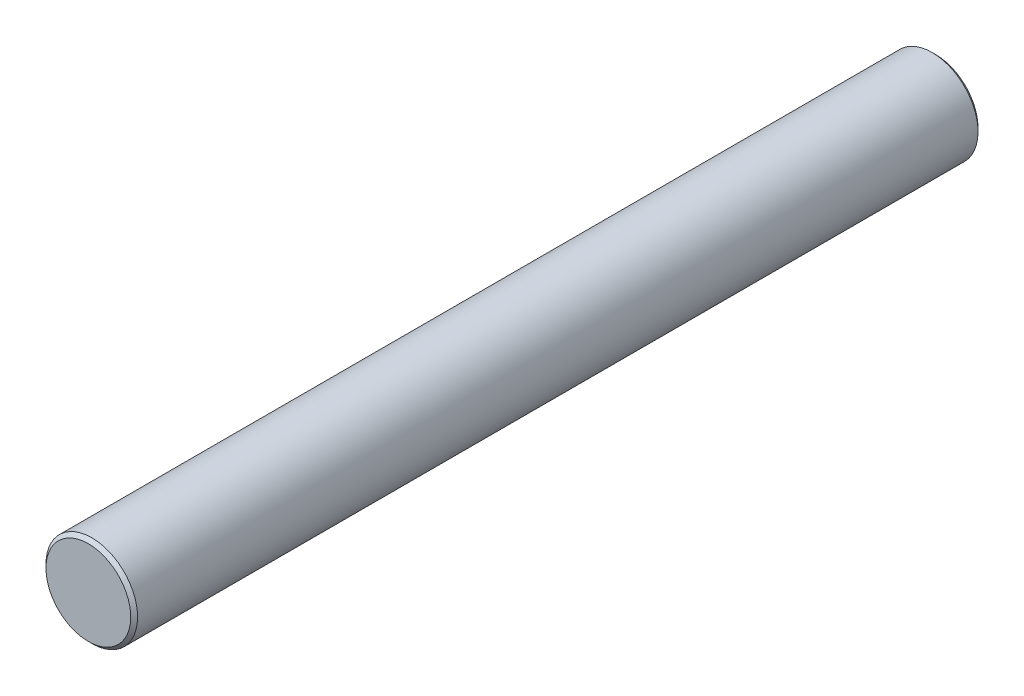
ISO-10303-21;
HEADER;
FILE_DESCRIPTION(('STEP AP214'),'2;1');
FILE_NAME('part.step','',(''),(''),'','','');
FILE_SCHEMA(('AUTOMOTIVE_DESIGN { 1 0 10303 214 1 1 1 1 }'));
ENDSEC;
DATA;
#1=APPLICATION_CONTEXT('core data for automotive mechanical design processes');
#2=APPLICATION_PROTOCOL_DEFINITION('international standard','automotive_design',2000,#1);
#3=PRODUCT_CONTEXT('',#1,'mechanical');
#4=PRODUCT('Part','Part','',(#3));
#5=PRODUCT_RELATED_PRODUCT_CATEGORY('part','',(#4));
#6=PRODUCT_DEFINITION_FORMATION('','',#4);
#7=PRODUCT_DEFINITION_CONTEXT('part definition',#1,'design');
#8=PRODUCT_DEFINITION('design','',#6,#7);
#9=PRODUCT_DEFINITION_SHAPE('','',#8);
#10=(LENGTH_UNIT() NAMED_UNIT(*) SI_UNIT(.MILLI.,.METRE.));
#11=(NAMED_UNIT(*) PLANE_ANGLE_UNIT() SI_UNIT($,.RADIAN.));
#12=(NAMED_UNIT(*) SI_UNIT($,.STERADIAN.) SOLID_ANGLE_UNIT());
#13=UNCERTAINTY_MEASURE_WITH_UNIT(LENGTH_MEASURE(1.E-05),#10,'distance_accuracy_value','');
#14=(GEOMETRIC_REPRESENTATION_CONTEXT(3) GLOBAL_UNCERTAINTY_ASSIGNED_CONTEXT((#13)) GLOBAL_UNIT_ASSIGNED_CONTEXT((#10,
#11,#12)) REPRESENTATION_CONTEXT('',''));
#15=CARTESIAN_POINT('',(0.,0.,0.));
#16=DIRECTION('',(0.,0.,1.));
#17=DIRECTION('',(1.,0.,0.));
#18=AXIS2_PLACEMENT_3D('',#15,#16,#17);
#19=CARTESIAN_POINT('',(0.,9.25,0.));
#20=DIRECTION('',(0.,0.,-1.));
#21=DIRECTION('',(0.,1.,0.));
#22=AXIS2_PLACEMENT_3D('',#19,#20,#21);
#23=PLANE('',#22);
#24=CARTESIAN_POINT('',(0.,0.,0.));
#25=DIRECTION('',(0.,0.,-1.));
#26=DIRECTION('',(0.,1.,0.));
#27=AXIS2_PLACEMENT_3D('',#24,#25,#26);
#28=CIRCLE('',#27,18.5);
#29=CARTESIAN_POINT('',(0.,18.5,0.));
#30=VERTEX_POINT('',#29);
#31=EDGE_CURVE('E9',#30,#30,#28,.T.);
#32=ORIENTED_EDGE('',*,*,#31,.T.);
#33=EDGE_LOOP('',(#32));
#34=FACE_BOUND('',#33,.T.);
#35=CARTESIAN_POINT('',(0.,0.,0.));
#36=DIRECTION('',(0.,0.,1.));
#37=DIRECTION('',(-1.,0.,0.));
#38=AXIS2_PLACEMENT_3D('',#35,#36,#37);
#39=CIRCLE('',#38,6.);
#40=CARTESIAN_POINT('',(-6.,0.,0.));
#41=VERTEX_POINT('',#40);
#42=EDGE_CURVE('E64',#41,#41,#39,.T.);
#43=ORIENTED_EDGE('',*,*,#42,.T.);
#44=EDGE_LOOP('',(#43));
#45=FACE_BOUND('',#44,.T.);
#46=ADVANCED_FACE('F15',(#34,#45),#23,.T.);
#47=CARTESIAN_POINT('',(0.,0.,0.75));
#48=DIRECTION('',(0.,0.,1.));
#49=DIRECTION('',(0.,1.,0.));
#50=AXIS2_PLACEMENT_3D('',#47,#48,#49);
#51=CONICAL_SURFACE('',#50,19.25,0.785398163397448);
#52=CARTESIAN_POINT('',(0.,0.,1.5));
#53=DIRECTION('',(0.,0.,-1.));
#54=DIRECTION('',(0.,1.,0.));
#55=AXIS2_PLACEMENT_3D('',#52,#53,#54);
#56=CIRCLE('',#55,20.);
#57=CARTESIAN_POINT('',(0.,20.,1.5));
#58=VERTEX_POINT('',#57);
#59=EDGE_CURVE('E22',#58,#58,#56,.T.);
#60=ORIENTED_EDGE('',*,*,#59,.T.);
#61=EDGE_LOOP('',(#60));
#62=FACE_BOUND('',#61,.T.);
#63=ORIENTED_EDGE('',*,*,#31,.F.);
#64=EDGE_LOOP('',(#63));
#65=FACE_BOUND('',#64,.T.);
#66=ADVANCED_FACE('F95',(#62,#65),#51,.T.);
#67=CARTESIAN_POINT('',(0.,0.,185.));
#68=DIRECTION('',(0.,0.,1.));
#69=DIRECTION('',(0.,1.,0.));
#70=AXIS2_PLACEMENT_3D('',#67,#68,#69);
#71=CYLINDRICAL_SURFACE('',#70,20.);
#72=CARTESIAN_POINT('',(0.,0.,368.5));
#73=DIRECTION('',(0.,0.,-1.));
#74=DIRECTION('',(0.,1.,0.));
#75=AXIS2_PLACEMENT_3D('',#72,#73,#74);
#76=CIRCLE('',#75,20.);
#77=CARTESIAN_POINT('',(0.,20.,368.5));
#78=VERTEX_POINT('',#77);
#79=EDGE_CURVE('E66',#78,#78,#76,.T.);
#80=ORIENTED_EDGE('',*,*,#79,.T.);
#81=EDGE_LOOP('',(#80));
#82=FACE_BOUND('',#81,.T.);
#83=ORIENTED_EDGE('',*,*,#59,.F.);
#84=EDGE_LOOP('',(#83));
#85=FACE_BOUND('',#84,.T.);
#86=CARTESIAN_POINT('',(0.,0.,6.5));
#87=DIRECTION('',(0.,0.,-1.));
#88=DIRECTION('',(0.,1.,0.));
#89=AXIS2_PLACEMENT_3D('',#86,#87,#88);
#90=CIRCLE('',#89,20.);
#91=CARTESIAN_POINT('',(10.5356537528527,-17.,6.5));
#92=VERTEX_POINT('',#91);
#93=CARTESIAN_POINT('',(-10.5356537528527,-17.,6.5));
#94=VERTEX_POINT('',#93);
#95=EDGE_CURVE('E139',#92,#94,#90,.T.);
#96=ORIENTED_EDGE('',*,*,#95,.T.);
#97=DIRECTION('',(0.,0.,1.));
#98=VECTOR('',#97,1.);
#99=CARTESIAN_POINT('',(-10.5356537528527,-17.,8.25));
#100=LINE('',#99,#98);
#101=CARTESIAN_POINT('',(-10.5356537528527,-17.,10.));
#102=VERTEX_POINT('',#101);
#103=EDGE_CURVE('E72',#94,#102,#100,.T.);
#104=ORIENTED_EDGE('',*,*,#103,.T.);
#105=CARTESIAN_POINT('',(0.,0.,10.));
#106=DIRECTION('',(0.,0.,1.));
#107=DIRECTION('',(0.,1.,0.));
#108=AXIS2_PLACEMENT_3D('',#105,#106,#107);
#109=CIRCLE('',#108,20.);
#110=CARTESIAN_POINT('',(10.5356537528527,-17.,10.));
#111=VERTEX_POINT('',#110);
#112=EDGE_CURVE('E133',#102,#111,#109,.T.);
#113=ORIENTED_EDGE('',*,*,#112,.T.);
#114=DIRECTION('',(0.,0.,-1.));
#115=VECTOR('',#114,1.);
#116=CARTESIAN_POINT('',(10.5356537528527,-17.,8.25));
#117=LINE('',#116,#115);
#118=EDGE_CURVE('E74',#111,#92,#117,.T.);
#119=ORIENTED_EDGE('',*,*,#118,.T.);
#120=EDGE_LOOP('',(#96,#104,#113,#119));
#121=FACE_BOUND('',#120,.T.);
#122=ADVANCED_FACE('F79',(#82,#85,#121),#71,.T.);
#123=CARTESIAN_POINT('',(0.,0.,369.25));
#124=DIRECTION('',(0.,0.,-1.));
#125=DIRECTION('',(0.,1.,0.));
#126=AXIS2_PLACEMENT_3D('',#123,#124,#125);
#127=CONICAL_SURFACE('',#126,19.25,0.785398163397448);
#128=CARTESIAN_POINT('',(0.,0.,370.));
#129=DIRECTION('',(0.,0.,-1.));
#130=DIRECTION('',(0.,1.,0.));
#131=AXIS2_PLACEMENT_3D('',#128,#129,#130);
#132=CIRCLE('',#131,18.5);
#133=CARTESIAN_POINT('',(0.,18.5,370.));
#134=VERTEX_POINT('',#133);
#135=EDGE_CURVE('E63',#134,#134,#132,.T.);
#136=ORIENTED_EDGE('',*,*,#135,.T.);
#137=EDGE_LOOP('',(#136));
#138=FACE_BOUND('',#137,.T.);
#139=ORIENTED_EDGE('',*,*,#79,.F.);
#140=EDGE_LOOP('',(#139));
#141=FACE_BOUND('',#140,.T.);
#142=ADVANCED_FACE('F82',(#138,#141),#127,.T.);
#143=CARTESIAN_POINT('',(0.,9.25,370.));
#144=DIRECTION('',(0.,0.,1.));
#145=DIRECTION('',(0.,-1.,0.));
#146=AXIS2_PLACEMENT_3D('',#143,#144,#145);
#147=PLANE('',#146);
#148=ORIENTED_EDGE('',*,*,#135,.F.);
#149=EDGE_LOOP('',(#148));
#150=FACE_BOUND('',#149,.T.);
#151=ADVANCED_FACE('F84',(#150),#147,.T.);
#152=CARTESIAN_POINT('',(0.,0.,26.4586213285198));
#153=DIRECTION('',(0.,0.,-1.));
#154=DIRECTION('',(-1.,0.,0.));
#155=AXIS2_PLACEMENT_3D('',#152,#153,#154);
#156=CONICAL_SURFACE('',#155,2.52640625,1.0471975511966);
#157=CARTESIAN_POINT('',(0.,0.,25.));
#158=DIRECTION('',(0.,0.,1.));
#159=DIRECTION('',(-1.,0.,0.));
#160=AXIS2_PLACEMENT_3D('',#157,#158,#159);
#161=CIRCLE('',#160,5.0528125);
#162=CARTESIAN_POINT('',(-5.0528125,0.,25.));
#163=VERTEX_POINT('',#162);
#164=EDGE_CURVE('E60',#163,#163,#161,.T.);
#165=ORIENTED_EDGE('',*,*,#164,.F.);
#166=EDGE_LOOP('',(#165));
#167=FACE_BOUND('',#166,.T.);
#168=CARTESIAN_POINT('',(0.,0.,27.9172426570397));
#169=VERTEX_POINT('',#168);
#170=VERTEX_LOOP('',#169);
#171=FACE_BOUND('',#170,.T.);
#172=ADVANCED_FACE('F92',(#167,#171),#156,.F.);
#173=CARTESIAN_POINT('',(0.,0.,12.97359375));
#174=DIRECTION('',(0.,0.,-1.));
#175=DIRECTION('',(-1.,0.,0.));
#176=AXIS2_PLACEMENT_3D('',#173,#174,#175);
#177=CYLINDRICAL_SURFACE('',#176,5.0528125);
#178=CARTESIAN_POINT('',(0.,0.,0.9471875));
#179=DIRECTION('',(0.,0.,1.));
#180=DIRECTION('',(-1.,0.,0.));
#181=AXIS2_PLACEMENT_3D('',#178,#179,#180);
#182=CIRCLE('',#181,5.0528125);
#183=CARTESIAN_POINT('',(-5.0528125,0.,0.9471875));
#184=VERTEX_POINT('',#183);
#185=EDGE_CURVE('E68',#184,#184,#182,.T.);
#186=ORIENTED_EDGE('',*,*,#185,.F.);
#187=EDGE_LOOP('',(#186));
#188=FACE_BOUND('',#187,.T.);
#189=ORIENTED_EDGE('',*,*,#164,.T.);
#190=EDGE_LOOP('',(#189));
#191=FACE_BOUND('',#190,.T.);
#192=ADVANCED_FACE('F61',(#188,#191),#177,.F.);
#193=CARTESIAN_POINT('',(0.,0.,0.47359375));
#194=DIRECTION('',(0.,0.,-1.));
#195=DIRECTION('',(-1.,0.,0.));
#196=AXIS2_PLACEMENT_3D('',#193,#194,#195);
#197=CONICAL_SURFACE('',#196,5.52640625,0.785398163397448);
#198=ORIENTED_EDGE('',*,*,#42,.F.);
#199=EDGE_LOOP('',(#198));
#200=FACE_BOUND('',#199,.T.);
#201=ORIENTED_EDGE('',*,*,#185,.T.);
#202=EDGE_LOOP('',(#201));
#203=FACE_BOUND('',#202,.T.);
#204=ADVANCED_FACE('F104',(#200,#203),#197,.F.);
#205=CARTESIAN_POINT('',(0.,-17.,8.25));
#206=DIRECTION('',(0.,-1.,0.));
#207=DIRECTION('',(0.,0.,-1.));
#208=AXIS2_PLACEMENT_3D('',#205,#206,#207);
#209=PLANE('',#208);
#210=ORIENTED_EDGE('',*,*,#103,.F.);
#211=DIRECTION('',(1.,0.,0.));
#212=VECTOR('',#211,1.);
#213=CARTESIAN_POINT('',(0.,-17.,6.5));
#214=LINE('',#213,#212);
#215=EDGE_CURVE('E143',#94,#92,#214,.T.);
#216=ORIENTED_EDGE('',*,*,#215,.T.);
#217=ORIENTED_EDGE('',*,*,#118,.F.);
#218=DIRECTION('',(-1.,0.,0.));
#219=VECTOR('',#218,1.);
#220=CARTESIAN_POINT('',(0.,-17.,10.));
#221=LINE('',#220,#219);
#222=EDGE_CURVE('E135',#111,#102,#221,.T.);
#223=ORIENTED_EDGE('',*,*,#222,.T.);
#224=EDGE_LOOP('',(#210,#216,#217,#223));
#225=FACE_BOUND('',#224,.T.);
#226=ADVANCED_FACE('F107',(#225),#209,.T.);
#227=CARTESIAN_POINT('',(0.,-19.5,6.5));
#228=DIRECTION('',(0.,0.,1.));
#229=DIRECTION('',(1.,0.,0.));
#230=AXIS2_PLACEMENT_3D('',#227,#228,#229);
#231=PLANE('',#230);
#232=ORIENTED_EDGE('',*,*,#95,.F.);
#233=ORIENTED_EDGE('',*,*,#215,.F.);
#234=EDGE_LOOP('',(#232,#233));
#235=FACE_BOUND('',#234,.T.);
#236=ADVANCED_FACE('F120',(#235),#231,.T.);
#237=CARTESIAN_POINT('',(0.,-19.5,10.));
#238=DIRECTION('',(0.,0.,1.));
#239=DIRECTION('',(1.,0.,0.));
#240=AXIS2_PLACEMENT_3D('',#237,#238,#239);
#241=PLANE('',#240);
#242=ORIENTED_EDGE('',*,*,#112,.F.);
#243=ORIENTED_EDGE('',*,*,#222,.F.);
#244=EDGE_LOOP('',(#242,#243));
#245=FACE_BOUND('',#244,.T.);
#246=ADVANCED_FACE('F124',(#245),#241,.F.);
#247=CLOSED_SHELL('',(#46,#66,#122,#142,#151,#172,#192,#204,#226,#236,#246));
#248=MANIFOLD_SOLID_BREP('B1',#247);
#249=ADVANCED_BREP_SHAPE_REPRESENTATION('',(#18,#248),#14);
#250=SHAPE_DEFINITION_REPRESENTATION(#9,#249);
ENDSEC;
END-ISO-10303-21;
